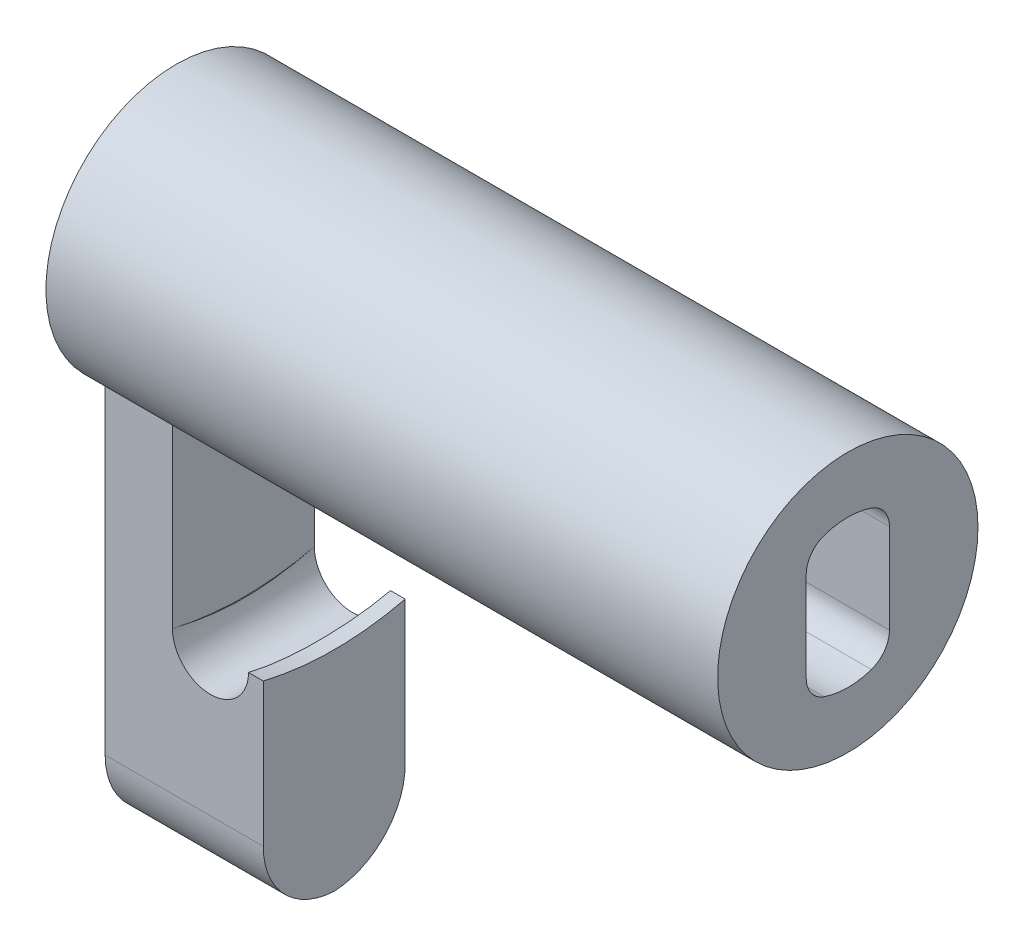
ISO-10303-21;
HEADER;
FILE_DESCRIPTION(('STEP AP214'),'2;1');
FILE_NAME('part.step','',(''),(''),'','','');
FILE_SCHEMA(('AUTOMOTIVE_DESIGN { 1 0 10303 214 1 1 1 1 }'));
ENDSEC;
DATA;
#1=APPLICATION_CONTEXT('core data for automotive mechanical design processes');
#2=APPLICATION_PROTOCOL_DEFINITION('international standard','automotive_design',2000,#1);
#3=PRODUCT_CONTEXT('',#1,'mechanical');
#4=PRODUCT('Part','Part','',(#3));
#5=PRODUCT_RELATED_PRODUCT_CATEGORY('part','',(#4));
#6=PRODUCT_DEFINITION_FORMATION('','',#4);
#7=PRODUCT_DEFINITION_CONTEXT('part definition',#1,'design');
#8=PRODUCT_DEFINITION('design','',#6,#7);
#9=PRODUCT_DEFINITION_SHAPE('','',#8);
#10=(LENGTH_UNIT() NAMED_UNIT(*) SI_UNIT(.MILLI.,.METRE.));
#11=(NAMED_UNIT(*) PLANE_ANGLE_UNIT() SI_UNIT($,.RADIAN.));
#12=(NAMED_UNIT(*) SI_UNIT($,.STERADIAN.) SOLID_ANGLE_UNIT());
#13=UNCERTAINTY_MEASURE_WITH_UNIT(LENGTH_MEASURE(1.E-05),#10,'distance_accuracy_value','');
#14=(GEOMETRIC_REPRESENTATION_CONTEXT(3) GLOBAL_UNCERTAINTY_ASSIGNED_CONTEXT((#13)) GLOBAL_UNIT_ASSIGNED_CONTEXT((#10,
#11,#12)) REPRESENTATION_CONTEXT('',''));
#15=CARTESIAN_POINT('',(0.,0.,0.));
#16=DIRECTION('',(0.,0.,1.));
#17=DIRECTION('',(1.,0.,0.));
#18=AXIS2_PLACEMENT_3D('',#15,#16,#17);
#19=CARTESIAN_POINT('',(-5.08441638698586,0.328655902743311,0.));
#20=DIRECTION('',(1.,0.,0.));
#21=DIRECTION('',(0.,0.,-1.));
#22=AXIS2_PLACEMENT_3D('',#19,#20,#21);
#23=CYLINDRICAL_SURFACE('',#22,20.32);
#24=CARTESIAN_POINT('',(4.516000112,-19.4253561897406,-4.7625));
#25=CARTESIAN_POINT('',(4.51602815605438,-19.4761397919226,-4.55186397752243));
#26=CARTESIAN_POINT('',(4.51751583624799,-19.5235494291915,-4.34042567248786));
#27=CARTESIAN_POINT('',(4.52241273918276,-19.6115780516741,-3.91617021463661));
#28=CARTESIAN_POINT('',(4.52582187954311,-19.6521973279214,-3.70335312132085));
#29=CARTESIAN_POINT('',(4.53356484956891,-19.7266136238928,-3.27650895221675));
#30=CARTESIAN_POINT('',(4.53789884704842,-19.7604094033339,-3.06248166371041));
#31=CARTESIAN_POINT('',(4.54668162054283,-19.8211392573607,-2.63345622071119));
#32=CARTESIAN_POINT('',(4.55113039739228,-19.8480732820403,-2.41845805916866));
#33=CARTESIAN_POINT('',(4.55940829823813,-19.8946999045536,-1.99093457231646));
#34=CARTESIAN_POINT('',(4.56324572568634,-19.9144951911243,-1.77842060795435));
#35=CARTESIAN_POINT('',(4.56989085821536,-19.9473821505317,-1.35285882034245));
#36=CARTESIAN_POINT('',(4.57269856674819,-19.9604738458416,-1.13981099888477));
#37=CARTESIAN_POINT('',(4.57695006547683,-19.9799372158945,-0.713428866385575));
#38=CARTESIAN_POINT('',(4.57839408420238,-19.9863100166236,-0.500094609348347));
#39=CARTESIAN_POINT('',(4.57976092663445,-19.9923324438611,-0.0733344566578538));
#40=CARTESIAN_POINT('',(4.57968377074263,-19.9919821605382,0.140091437728));
#41=CARTESIAN_POINT('',(4.57738082088596,-19.9818550621192,0.722132801893545));
#42=CARTESIAN_POINT('',(4.57363213215137,-19.9654032258704,1.09064622910877));
#43=CARTESIAN_POINT('',(4.56276431571364,-19.9124753478223,1.82619125768275));
#44=CARTESIAN_POINT('',(4.55564506983982,-19.8759986039487,2.19322280663227));
#45=CARTESIAN_POINT('',(4.54443834937838,-19.8060515095709,2.74424017250821));
#46=CARTESIAN_POINT('',(4.54058795591981,-19.7799763668355,2.92919724796145));
#47=CARTESIAN_POINT('',(4.53321609973828,-19.7227352488764,3.29833186147396));
#48=CARTESIAN_POINT('',(4.52969463377984,-19.6915693237359,3.48250940718395));
#49=CARTESIAN_POINT('',(4.52352813229226,-19.6241685777428,3.84994564719896));
#50=CARTESIAN_POINT('',(4.52088307740102,-19.5879338688973,4.03320436171511));
#51=CARTESIAN_POINT('',(4.51712674764682,-19.5104208287468,4.398674485403));
#52=CARTESIAN_POINT('',(4.51601553356354,-19.4691422976468,4.58088585278788));
#53=CARTESIAN_POINT('',(4.516000112,-19.4253561897406,4.76250000000001));
#54=B_SPLINE_CURVE_WITH_KNOTS('',3,(#24,#25,#26,#27,#28,#29,#30,#31,#32,#33,#34,#35,#36,#37,#38,
#39,#40,#41,#42,#43,#44,#45,#46,#47,#48,#49,#50,#51,#52,#53),.UNSPECIFIED.,.F.,.F.,(4,2,2,2,2,2,
2,2,2,2,2,2,2,2,4),(0.,0.649966912191417,1.29990595977909,1.94996303834195,2.60002484467298,
3.24032284066848,3.88061869011341,4.52080721850776,5.16098716083363,6.26708531920134,
7.37322225989914,7.93364039667409,8.49405302037505,9.05445326235574,9.61487571001093),.UNSPECIFIED.);
#55=CARTESIAN_POINT('',(4.516000112,-19.4253561897406,-4.7625));
#56=VERTEX_POINT('',#55);
#57=CARTESIAN_POINT('',(4.516000112,-19.4253561897406,4.7625));
#58=VERTEX_POINT('',#57);
#59=EDGE_CURVE('E221',#56,#58,#54,.T.);
#60=ORIENTED_EDGE('',*,*,#59,.F.);
#61=CARTESIAN_POINT('',(4.516000112,0.328655902743311,0.));
#62=DIRECTION('',(-1.,0.,0.));
#63=DIRECTION('',(0.,0.,1.));
#64=AXIS2_PLACEMENT_3D('',#61,#62,#63);
#65=CIRCLE('',#64,20.32);
#66=EDGE_CURVE('E247',#56,#58,#65,.T.);
#67=ORIENTED_EDGE('',*,*,#66,.T.);
#68=EDGE_LOOP('',(#60,#67));
#69=FACE_BOUND('',#68,.T.);
#70=ADVANCED_FACE('F49',(#69),#23,.F.);
#71=CARTESIAN_POINT('',(45.085,0.,0.));
#72=DIRECTION('',(-1.,0.,0.));
#73=DIRECTION('',(0.,0.,1.));
#74=AXIS2_PLACEMENT_3D('',#71,#72,#73);
#75=CYLINDRICAL_SURFACE('',#74,8.7376);
#76=CARTESIAN_POINT('',(45.085,0.,0.));
#77=DIRECTION('',(1.,0.,0.));
#78=DIRECTION('',(0.,0.,-1.));
#79=AXIS2_PLACEMENT_3D('',#76,#77,#78);
#80=CIRCLE('',#79,8.7376);
#81=CARTESIAN_POINT('',(45.085,0.,-8.7376));
#82=VERTEX_POINT('',#81);
#83=EDGE_CURVE('E291',#82,#82,#80,.T.);
#84=ORIENTED_EDGE('',*,*,#83,.F.);
#85=EDGE_LOOP('',(#84));
#86=FACE_BOUND('',#85,.T.);
#87=DIRECTION('',(-1.,0.,0.));
#88=VECTOR('',#87,1.);
#89=CARTESIAN_POINT('',(4.516000112,-7.32558854359157,-4.7625));
#90=LINE('',#89,#88);
#91=CARTESIAN_POINT('',(4.516000112,-7.32558854359157,-4.7625));
#92=VERTEX_POINT('',#91);
#93=CARTESIAN_POINT('',(0.,-7.32558854359157,-4.7625));
#94=VERTEX_POINT('',#93);
#95=EDGE_CURVE('E283',#92,#94,#90,.T.);
#96=ORIENTED_EDGE('',*,*,#95,.T.);
#97=CARTESIAN_POINT('',(0.,0.,0.));
#98=DIRECTION('',(1.,0.,0.));
#99=DIRECTION('',(0.,0.,-1.));
#100=AXIS2_PLACEMENT_3D('',#97,#98,#99);
#101=CIRCLE('',#100,8.7376);
#102=CARTESIAN_POINT('',(0.,-7.32558854359157,4.7625));
#103=VERTEX_POINT('',#102);
#104=EDGE_CURVE('E287',#94,#103,#101,.T.);
#105=ORIENTED_EDGE('',*,*,#104,.T.);
#106=DIRECTION('',(-1.,0.,0.));
#107=VECTOR('',#106,1.);
#108=CARTESIAN_POINT('',(4.516000112,-7.32558854359157,4.7625));
#109=LINE('',#108,#107);
#110=CARTESIAN_POINT('',(4.516000112,-7.32558854359157,4.7625));
#111=VERTEX_POINT('',#110);
#112=EDGE_CURVE('E276',#111,#103,#109,.T.);
#113=ORIENTED_EDGE('',*,*,#112,.F.);
#114=CARTESIAN_POINT('',(4.516000112,0.,0.));
#115=DIRECTION('',(-1.,0.,0.));
#116=DIRECTION('',(0.,0.,1.));
#117=AXIS2_PLACEMENT_3D('',#114,#115,#116);
#118=CIRCLE('',#117,8.7376);
#119=EDGE_CURVE('E272',#92,#111,#118,.T.);
#120=ORIENTED_EDGE('',*,*,#119,.F.);
#121=EDGE_LOOP('',(#96,#105,#113,#120));
#122=FACE_BOUND('',#121,.T.);
#123=ADVANCED_FACE('F411',(#86,#122),#75,.T.);
#124=CARTESIAN_POINT('',(45.085,0.,0.));
#125=DIRECTION('',(1.,0.,0.));
#126=DIRECTION('',(0.,0.,-1.));
#127=AXIS2_PLACEMENT_3D('',#124,#125,#126);
#128=PLANE('',#127);
#129=CARTESIAN_POINT('',(45.085,0.,0.));
#130=DIRECTION('',(1.,0.,0.));
#131=DIRECTION('',(0.,0.,-1.));
#132=AXIS2_PLACEMENT_3D('',#129,#130,#131);
#133=CIRCLE('',#132,4.953);
#134=CARTESIAN_POINT('',(45.085,4.69255908842926,-1.58496));
#135=VERTEX_POINT('',#134);
#136=CARTESIAN_POINT('',(45.085,4.69255908842926,1.58496));
#137=VERTEX_POINT('',#136);
#138=EDGE_CURVE('E520',#135,#137,#133,.T.);
#139=ORIENTED_EDGE('',*,*,#138,.F.);
#140=CARTESIAN_POINT('',(45.085,3.00805069771106,-1.016));
#141=DIRECTION('',(1.,0.,0.));
#142=DIRECTION('',(0.,0.,-1.));
#143=AXIS2_PLACEMENT_3D('',#140,#141,#142);
#144=CIRCLE('',#143,1.778);
#145=CARTESIAN_POINT('',(45.085,3.00805069771106,-2.794));
#146=VERTEX_POINT('',#145);
#147=EDGE_CURVE('E352',#135,#146,#144,.F.);
#148=ORIENTED_EDGE('',*,*,#147,.T.);
#149=DIRECTION('',(0.,1.,0.));
#150=VECTOR('',#149,1.);
#151=CARTESIAN_POINT('',(45.085,-4.08971551577857,-2.794));
#152=LINE('',#151,#150);
#153=CARTESIAN_POINT('',(45.085,-3.00805069771106,-2.794));
#154=VERTEX_POINT('',#153);
#155=EDGE_CURVE('E526',#154,#146,#152,.T.);
#156=ORIENTED_EDGE('',*,*,#155,.F.);
#157=CARTESIAN_POINT('',(45.085,-3.00805069771106,-1.016));
#158=DIRECTION('',(1.,0.,0.));
#159=DIRECTION('',(0.,0.,-1.));
#160=AXIS2_PLACEMENT_3D('',#157,#158,#159);
#161=CIRCLE('',#160,1.778);
#162=CARTESIAN_POINT('',(45.085,-4.69255908842926,-1.58496));
#163=VERTEX_POINT('',#162);
#164=EDGE_CURVE('E358',#154,#163,#161,.F.);
#165=ORIENTED_EDGE('',*,*,#164,.T.);
#166=CARTESIAN_POINT('',(45.085,0.,0.));
#167=DIRECTION('',(1.,0.,0.));
#168=DIRECTION('',(0.,0.,-1.));
#169=AXIS2_PLACEMENT_3D('',#166,#167,#168);
#170=CIRCLE('',#169,4.953);
#171=CARTESIAN_POINT('',(45.085,-4.69255908842926,1.58496));
#172=VERTEX_POINT('',#171);
#173=EDGE_CURVE('E545',#172,#163,#170,.T.);
#174=ORIENTED_EDGE('',*,*,#173,.F.);
#175=CARTESIAN_POINT('',(45.085,-3.00805069771106,1.016));
#176=DIRECTION('',(1.,0.,0.));
#177=DIRECTION('',(0.,0.,-1.));
#178=AXIS2_PLACEMENT_3D('',#175,#176,#177);
#179=CIRCLE('',#178,1.778);
#180=CARTESIAN_POINT('',(45.085,-3.00805069771106,2.794));
#181=VERTEX_POINT('',#180);
#182=EDGE_CURVE('E222',#172,#181,#179,.F.);
#183=ORIENTED_EDGE('',*,*,#182,.T.);
#184=DIRECTION('',(0.,-1.,0.));
#185=VECTOR('',#184,1.);
#186=CARTESIAN_POINT('',(45.085,-4.08971551577857,2.794));
#187=LINE('',#186,#185);
#188=CARTESIAN_POINT('',(45.085,3.00805069771106,2.794));
#189=VERTEX_POINT('',#188);
#190=EDGE_CURVE('E541',#189,#181,#187,.T.);
#191=ORIENTED_EDGE('',*,*,#190,.F.);
#192=CARTESIAN_POINT('',(45.085,3.00805069771106,1.016));
#193=DIRECTION('',(1.,0.,0.));
#194=DIRECTION('',(0.,0.,-1.));
#195=AXIS2_PLACEMENT_3D('',#192,#193,#194);
#196=CIRCLE('',#195,1.778);
#197=EDGE_CURVE('E355',#189,#137,#196,.F.);
#198=ORIENTED_EDGE('',*,*,#197,.T.);
#199=EDGE_LOOP('',(#139,#148,#156,#165,#174,#183,#191,#198));
#200=FACE_BOUND('',#199,.T.);
#201=ORIENTED_EDGE('',*,*,#83,.T.);
#202=EDGE_LOOP('',(#201));
#203=FACE_BOUND('',#202,.T.);
#204=ADVANCED_FACE('F418',(#200,#203),#128,.T.);
#205=CARTESIAN_POINT('',(0.,0.,0.));
#206=DIRECTION('',(1.,0.,0.));
#207=DIRECTION('',(0.,0.,-1.));
#208=AXIS2_PLACEMENT_3D('',#205,#206,#207);
#209=PLANE('',#208);
#210=CARTESIAN_POINT('',(0.,0.,0.));
#211=DIRECTION('',(-1.,0.,0.));
#212=DIRECTION('',(0.,0.,1.));
#213=AXIS2_PLACEMENT_3D('',#210,#211,#212);
#214=CIRCLE('',#213,4.064);
#215=CARTESIAN_POINT('',(0.,-3.29817815590477,2.37447191011236));
#216=VERTEX_POINT('',#215);
#217=CARTESIAN_POINT('',(0.,-3.29817815590477,-2.37447191011236));
#218=VERTEX_POINT('',#217);
#219=EDGE_CURVE('E510',#216,#218,#214,.T.);
#220=ORIENTED_EDGE('',*,*,#219,.F.);
#221=CARTESIAN_POINT('',(0.,-4.58652899805506,3.302));
#222=DIRECTION('',(1.,0.,0.));
#223=DIRECTION('',(0.,0.,-1.));
#224=AXIS2_PLACEMENT_3D('',#221,#222,#223);
#225=CIRCLE('',#224,1.5875);
#226=CARTESIAN_POINT('',(0.,-4.58652899805506,1.7145));
#227=VERTEX_POINT('',#226);
#228=EDGE_CURVE('E437',#216,#227,#225,.F.);
#229=ORIENTED_EDGE('',*,*,#228,.T.);
#230=DIRECTION('',(0.,1.,0.));
#231=VECTOR('',#230,1.);
#232=CARTESIAN_POINT('',(0.,-3.68464187540662,1.7145));
#233=LINE('',#232,#231);
#234=CARTESIAN_POINT('',(0.,-5.58964187540662,1.7145));
#235=VERTEX_POINT('',#234);
#236=EDGE_CURVE('E481',#235,#227,#233,.T.);
#237=ORIENTED_EDGE('',*,*,#236,.F.);
#238=CARTESIAN_POINT('',(0.,-5.58964187540662,0.127));
#239=DIRECTION('',(1.,0.,0.));
#240=DIRECTION('',(0.,0.,-1.));
#241=AXIS2_PLACEMENT_3D('',#238,#239,#240);
#242=CIRCLE('',#241,1.5875);
#243=CARTESIAN_POINT('',(0.,-7.17714187540662,0.127));
#244=VERTEX_POINT('',#243);
#245=EDGE_CURVE('E469',#235,#244,#242,.T.);
#246=ORIENTED_EDGE('',*,*,#245,.T.);
#247=DIRECTION('',(0.,0.,1.));
#248=VECTOR('',#247,1.);
#249=CARTESIAN_POINT('',(0.,-7.17714187540662,1.7145));
#250=LINE('',#249,#248);
#251=CARTESIAN_POINT('',(0.,-7.17714187540662,-0.127000000000001));
#252=VERTEX_POINT('',#251);
#253=EDGE_CURVE('E479',#252,#244,#250,.T.);
#254=ORIENTED_EDGE('',*,*,#253,.F.);
#255=CARTESIAN_POINT('',(0.,-5.58964187540662,-0.127));
#256=DIRECTION('',(1.,0.,0.));
#257=DIRECTION('',(0.,0.,-1.));
#258=AXIS2_PLACEMENT_3D('',#255,#256,#257);
#259=CIRCLE('',#258,1.5875);
#260=CARTESIAN_POINT('',(0.,-5.58964187540662,-1.7145));
#261=VERTEX_POINT('',#260);
#262=EDGE_CURVE('E11',#252,#261,#259,.T.);
#263=ORIENTED_EDGE('',*,*,#262,.T.);
#264=DIRECTION('',(0.,-1.,0.));
#265=VECTOR('',#264,1.);
#266=CARTESIAN_POINT('',(0.,-3.68464187540662,-1.7145));
#267=LINE('',#266,#265);
#268=CARTESIAN_POINT('',(0.,-4.58652899805506,-1.7145));
#269=VERTEX_POINT('',#268);
#270=EDGE_CURVE('E491',#269,#261,#267,.T.);
#271=ORIENTED_EDGE('',*,*,#270,.F.);
#272=CARTESIAN_POINT('',(0.,-4.58652899805506,-3.302));
#273=DIRECTION('',(1.,0.,0.));
#274=DIRECTION('',(0.,0.,-1.));
#275=AXIS2_PLACEMENT_3D('',#272,#273,#274);
#276=CIRCLE('',#275,1.5875);
#277=EDGE_CURVE('E432',#269,#218,#276,.F.);
#278=ORIENTED_EDGE('',*,*,#277,.T.);
#279=EDGE_LOOP('',(#220,#229,#237,#246,#254,#263,#271,#278));
#280=FACE_BOUND('',#279,.T.);
#281=CARTESIAN_POINT('',(0.,-29.036,0.2375));
#282=DIRECTION('',(1.,0.,0.));
#283=DIRECTION('',(0.,0.,-1.));
#284=AXIS2_PLACEMENT_3D('',#281,#282,#283);
#285=CIRCLE('',#284,5.);
#286=CARTESIAN_POINT('',(0.,-29.036,-4.7625));
#287=VERTEX_POINT('',#286);
#288=CARTESIAN_POINT('',(0.,-34.0303561897406,0.));
#289=VERTEX_POINT('',#288);
#290=EDGE_CURVE('E295',#287,#289,#285,.F.);
#291=ORIENTED_EDGE('',*,*,#290,.T.);
#292=CARTESIAN_POINT('',(0.,-29.036,-0.2375));
#293=DIRECTION('',(1.,0.,0.));
#294=DIRECTION('',(0.,0.,-1.));
#295=AXIS2_PLACEMENT_3D('',#292,#293,#294);
#296=CIRCLE('',#295,5.);
#297=CARTESIAN_POINT('',(0.,-29.036,4.7625));
#298=VERTEX_POINT('',#297);
#299=EDGE_CURVE('E300',#289,#298,#296,.F.);
#300=ORIENTED_EDGE('',*,*,#299,.T.);
#301=DIRECTION('',(0.,-1.,0.));
#302=VECTOR('',#301,1.);
#303=CARTESIAN_POINT('',(0.,0.,4.7625));
#304=LINE('',#303,#302);
#305=EDGE_CURVE('E268',#103,#298,#304,.T.);
#306=ORIENTED_EDGE('',*,*,#305,.F.);
#307=ORIENTED_EDGE('',*,*,#104,.F.);
#308=DIRECTION('',(0.,1.,0.));
#309=VECTOR('',#308,1.);
#310=CARTESIAN_POINT('',(0.,0.,-4.7625));
#311=LINE('',#310,#309);
#312=EDGE_CURVE('E277',#287,#94,#311,.T.);
#313=ORIENTED_EDGE('',*,*,#312,.F.);
#314=EDGE_LOOP('',(#291,#300,#306,#307,#313));
#315=FACE_BOUND('',#314,.T.);
#316=ADVANCED_FACE('F477',(#280,#315),#209,.F.);
#317=CARTESIAN_POINT('',(4.516000112,0.,-4.7625));
#318=DIRECTION('',(0.,0.,1.));
#319=DIRECTION('',(1.,0.,0.));
#320=AXIS2_PLACEMENT_3D('',#317,#318,#319);
#321=PLANE('',#320);
#322=DIRECTION('',(0.,1.,0.));
#323=VECTOR('',#322,1.);
#324=CARTESIAN_POINT('',(4.516000112,0.,-4.7625));
#325=LINE('',#324,#323);
#326=EDGE_CURVE('E231',#56,#92,#325,.T.);
#327=ORIENTED_EDGE('',*,*,#326,.F.);
#328=CARTESIAN_POINT('',(7.068700112,-19.4253561897406,-4.7625));
#329=DIRECTION('',(0.,0.,-1.));
#330=DIRECTION('',(0.,1.,0.));
#331=AXIS2_PLACEMENT_3D('',#328,#329,#330);
#332=CIRCLE('',#331,2.5527);
#333=CARTESIAN_POINT('',(9.621400112,-19.4253561897406,-4.7625));
#334=VERTEX_POINT('',#333);
#335=EDGE_CURVE('E213',#334,#56,#332,.T.);
#336=ORIENTED_EDGE('',*,*,#335,.F.);
#337=DIRECTION('',(1.,0.,0.));
#338=VECTOR('',#337,1.);
#339=CARTESIAN_POINT('',(-5.08441638698586,-19.4253561897406,-4.7625));
#340=LINE('',#339,#338);
#341=CARTESIAN_POINT('',(10.612000112,-19.4253561897406,-4.7625));
#342=VERTEX_POINT('',#341);
#343=EDGE_CURVE('E228',#334,#342,#340,.T.);
#344=ORIENTED_EDGE('',*,*,#343,.T.);
#345=DIRECTION('',(0.,1.,0.));
#346=VECTOR('',#345,1.);
#347=CARTESIAN_POINT('',(10.612000112,0.,-4.7625));
#348=LINE('',#347,#346);
#349=CARTESIAN_POINT('',(10.612000112,-29.036,-4.7625));
#350=VERTEX_POINT('',#349);
#351=EDGE_CURVE('E261',#350,#342,#348,.T.);
#352=ORIENTED_EDGE('',*,*,#351,.F.);
#353=DIRECTION('',(-1.,0.,0.));
#354=VECTOR('',#353,1.);
#355=CARTESIAN_POINT('',(4.516000112,-29.036,-4.7625));
#356=LINE('',#355,#354);
#357=EDGE_CURVE('E307',#350,#287,#356,.T.);
#358=ORIENTED_EDGE('',*,*,#357,.T.);
#359=ORIENTED_EDGE('',*,*,#312,.T.);
#360=ORIENTED_EDGE('',*,*,#95,.F.);
#361=EDGE_LOOP('',(#327,#336,#344,#352,#358,#359,#360));
#362=FACE_BOUND('',#361,.T.);
#363=ADVANCED_FACE('F226',(#362),#321,.F.);
#364=CARTESIAN_POINT('',(4.516000112,0.,4.7625));
#365=DIRECTION('',(0.,0.,-1.));
#366=DIRECTION('',(-1.,0.,0.));
#367=AXIS2_PLACEMENT_3D('',#364,#365,#366);
#368=PLANE('',#367);
#369=DIRECTION('',(1.,0.,0.));
#370=VECTOR('',#369,1.);
#371=CARTESIAN_POINT('',(-5.08441638698586,-19.4253561897406,4.7625));
#372=LINE('',#371,#370);
#373=CARTESIAN_POINT('',(9.62140011200001,-19.4253561897406,4.7625));
#374=VERTEX_POINT('',#373);
#375=CARTESIAN_POINT('',(10.612000112,-19.4253561897406,4.7625));
#376=VERTEX_POINT('',#375);
#377=EDGE_CURVE('E241',#374,#376,#372,.T.);
#378=ORIENTED_EDGE('',*,*,#377,.F.);
#379=CARTESIAN_POINT('',(7.068700112,-19.4253561897406,4.7625));
#380=DIRECTION('',(0.,0.,-1.));
#381=DIRECTION('',(-1.,0.,0.));
#382=AXIS2_PLACEMENT_3D('',#379,#380,#381);
#383=CIRCLE('',#382,2.5527);
#384=EDGE_CURVE('E216',#374,#58,#383,.T.);
#385=ORIENTED_EDGE('',*,*,#384,.T.);
#386=DIRECTION('',(0.,-1.,0.));
#387=VECTOR('',#386,1.);
#388=CARTESIAN_POINT('',(4.516000112,0.,4.7625));
#389=LINE('',#388,#387);
#390=EDGE_CURVE('E267',#111,#58,#389,.T.);
#391=ORIENTED_EDGE('',*,*,#390,.F.);
#392=ORIENTED_EDGE('',*,*,#112,.T.);
#393=ORIENTED_EDGE('',*,*,#305,.T.);
#394=DIRECTION('',(-1.,0.,0.));
#395=VECTOR('',#394,1.);
#396=CARTESIAN_POINT('',(4.516000112,-29.036,4.7625));
#397=LINE('',#396,#395);
#398=CARTESIAN_POINT('',(10.612000112,-29.036,4.7625));
#399=VERTEX_POINT('',#398);
#400=EDGE_CURVE('E303',#298,#399,#397,.F.);
#401=ORIENTED_EDGE('',*,*,#400,.T.);
#402=DIRECTION('',(0.,-1.,0.));
#403=VECTOR('',#402,1.);
#404=CARTESIAN_POINT('',(10.612000112,0.,4.7625));
#405=LINE('',#404,#403);
#406=EDGE_CURVE('E245',#376,#399,#405,.T.);
#407=ORIENTED_EDGE('',*,*,#406,.F.);
#408=EDGE_LOOP('',(#378,#385,#391,#392,#393,#401,#407));
#409=FACE_BOUND('',#408,.T.);
#410=ADVANCED_FACE('F590',(#409),#368,.F.);
#411=CARTESIAN_POINT('',(4.516000112,0.,0.));
#412=DIRECTION('',(-1.,0.,0.));
#413=DIRECTION('',(0.,0.,1.));
#414=AXIS2_PLACEMENT_3D('',#411,#412,#413);
#415=PLANE('',#414);
#416=ORIENTED_EDGE('',*,*,#390,.T.);
#417=ORIENTED_EDGE('',*,*,#66,.F.);
#418=ORIENTED_EDGE('',*,*,#326,.T.);
#419=ORIENTED_EDGE('',*,*,#119,.T.);
#420=EDGE_LOOP('',(#416,#417,#418,#419));
#421=FACE_BOUND('',#420,.T.);
#422=ADVANCED_FACE('F602',(#421),#415,.F.);
#423=CARTESIAN_POINT('',(4.516000112,-29.036,0.2375));
#424=DIRECTION('',(-1.,0.,0.));
#425=DIRECTION('',(0.,0.,1.));
#426=AXIS2_PLACEMENT_3D('',#423,#424,#425);
#427=CYLINDRICAL_SURFACE('',#426,5.);
#428=ORIENTED_EDGE('',*,*,#357,.F.);
#429=CARTESIAN_POINT('',(10.612000112,-29.036,0.2375));
#430=DIRECTION('',(1.,0.,0.));
#431=DIRECTION('',(0.,0.,-1.));
#432=AXIS2_PLACEMENT_3D('',#429,#430,#431);
#433=CIRCLE('',#432,5.);
#434=CARTESIAN_POINT('',(10.612000112,-34.0303561897406,0.));
#435=VERTEX_POINT('',#434);
#436=EDGE_CURVE('E257',#435,#350,#433,.T.);
#437=ORIENTED_EDGE('',*,*,#436,.F.);
#438=DIRECTION('',(-1.,0.,0.));
#439=VECTOR('',#438,1.);
#440=CARTESIAN_POINT('',(2.258000056,-34.0303561897406,0.));
#441=LINE('',#440,#439);
#442=EDGE_CURVE('E264',#289,#435,#441,.F.);
#443=ORIENTED_EDGE('',*,*,#442,.F.);
#444=ORIENTED_EDGE('',*,*,#290,.F.);
#445=EDGE_LOOP('',(#428,#437,#443,#444));
#446=FACE_BOUND('',#445,.T.);
#447=ADVANCED_FACE('F600',(#446),#427,.T.);
#448=CARTESIAN_POINT('',(4.516000112,-29.036,-0.2375));
#449=DIRECTION('',(-1.,0.,0.));
#450=DIRECTION('',(0.,0.,1.));
#451=AXIS2_PLACEMENT_3D('',#448,#449,#450);
#452=CYLINDRICAL_SURFACE('',#451,5.);
#453=ORIENTED_EDGE('',*,*,#442,.T.);
#454=CARTESIAN_POINT('',(10.612000112,-29.036,-0.2375));
#455=DIRECTION('',(1.,0.,0.));
#456=DIRECTION('',(0.,0.,-1.));
#457=AXIS2_PLACEMENT_3D('',#454,#455,#456);
#458=CIRCLE('',#457,5.);
#459=EDGE_CURVE('E253',#399,#435,#458,.T.);
#460=ORIENTED_EDGE('',*,*,#459,.F.);
#461=ORIENTED_EDGE('',*,*,#400,.F.);
#462=ORIENTED_EDGE('',*,*,#299,.F.);
#463=EDGE_LOOP('',(#453,#460,#461,#462));
#464=FACE_BOUND('',#463,.T.);
#465=ADVANCED_FACE('F595',(#464),#452,.T.);
#466=CARTESIAN_POINT('',(10.612000112,0.,0.));
#467=DIRECTION('',(1.,0.,0.));
#468=DIRECTION('',(0.,0.,-1.));
#469=AXIS2_PLACEMENT_3D('',#466,#467,#468);
#470=PLANE('',#469);
#471=ORIENTED_EDGE('',*,*,#351,.T.);
#472=CARTESIAN_POINT('',(10.612000112,0.328655902743311,0.));
#473=DIRECTION('',(1.,0.,0.));
#474=DIRECTION('',(0.,0.,-1.));
#475=AXIS2_PLACEMENT_3D('',#472,#473,#474);
#476=CIRCLE('',#475,20.32);
#477=EDGE_CURVE('E238',#342,#376,#476,.F.);
#478=ORIENTED_EDGE('',*,*,#477,.T.);
#479=ORIENTED_EDGE('',*,*,#406,.T.);
#480=ORIENTED_EDGE('',*,*,#459,.T.);
#481=ORIENTED_EDGE('',*,*,#436,.T.);
#482=EDGE_LOOP('',(#471,#478,#479,#480,#481));
#483=FACE_BOUND('',#482,.T.);
#484=ADVANCED_FACE('F408',(#483),#470,.T.);
#485=CARTESIAN_POINT('',(9.62140011200001,-19.4253561897406,4.76250000000001));
#486=CARTESIAN_POINT('',(9.62137206794563,-19.4761397919226,4.55186397752244));
#487=CARTESIAN_POINT('',(9.61988438775201,-19.5235494291915,4.34042567248786));
#488=CARTESIAN_POINT('',(9.61498748481723,-19.6115780516741,3.91617021463662));
#489=CARTESIAN_POINT('',(9.61157834445689,-19.6521973279214,3.70335312132086));
#490=CARTESIAN_POINT('',(9.60383537443108,-19.7266136238928,3.27650895221675));
#491=CARTESIAN_POINT('',(9.59950137695158,-19.7604094033339,3.06248166371042));
#492=CARTESIAN_POINT('',(9.59071860345717,-19.8211392573607,2.6334562207112));
#493=CARTESIAN_POINT('',(9.58626982660772,-19.8480732820403,2.41845805916867));
#494=CARTESIAN_POINT('',(9.57799192576186,-19.8946999045536,1.99093457231647));
#495=CARTESIAN_POINT('',(9.57415449831365,-19.9144951911243,1.77842060795436));
#496=CARTESIAN_POINT('',(9.56750936578464,-19.9473821505317,1.35285882034246));
#497=CARTESIAN_POINT('',(9.56470165725181,-19.9604738458416,1.13981099888478));
#498=CARTESIAN_POINT('',(9.56045015852317,-19.9799372158945,0.713428866385582));
#499=CARTESIAN_POINT('',(9.55900613979761,-19.9863100166236,0.500094609348354));
#500=CARTESIAN_POINT('',(9.55763929736555,-19.9923324438611,0.0733344566578609));
#501=CARTESIAN_POINT('',(9.55771645325737,-19.9919821605382,-0.140091437727993));
#502=CARTESIAN_POINT('',(9.56001940311404,-19.9818550621192,-0.722132801893537));
#503=CARTESIAN_POINT('',(9.56376809184863,-19.9654032258704,-1.09064622910876));
#504=CARTESIAN_POINT('',(9.57463590828636,-19.9124753478223,-1.82619125768275));
#505=CARTESIAN_POINT('',(9.58175515416018,-19.8759986039487,-2.19322280663227));
#506=CARTESIAN_POINT('',(9.59296187462162,-19.8060515095709,-2.7442401725082));
#507=CARTESIAN_POINT('',(9.59681226808018,-19.7799763668355,-2.92919724796144));
#508=CARTESIAN_POINT('',(9.60418412426172,-19.7227352488764,-3.29833186147394));
#509=CARTESIAN_POINT('',(9.60770559022015,-19.6915693237359,-3.48250940718394));
#510=CARTESIAN_POINT('',(9.61387209170774,-19.6241685777428,-3.84994564719895));
#511=CARTESIAN_POINT('',(9.61651714659898,-19.5879338688973,-4.03320436171509));
#512=CARTESIAN_POINT('',(9.62027347635317,-19.5104208287468,-4.39867448540299));
#513=CARTESIAN_POINT('',(9.62138469043646,-19.4691422976468,-4.58088585278787));
#514=CARTESIAN_POINT('',(9.621400112,-19.4253561897406,-4.7625));
#515=B_SPLINE_CURVE_WITH_KNOTS('',3,(#485,#486,#487,#488,#489,#490,#491,#492,#493,#494,#495,
#496,#497,#498,#499,#500,#501,#502,#503,#504,#505,#506,#507,#508,#509,#510,#511,#512,#513,#514),
.UNSPECIFIED.,.F.,.F.,(4,2,2,2,2,2,2,2,2,2,2,2,2,2,4),(0.,0.649966912191416,1.29990595977909,
1.94996303834195,2.60002484467298,3.24032284066848,3.88061869011341,4.52080721850776,
5.16098716083363,6.26708531920134,7.37322225989914,7.93364039667409,8.49405302037505,
9.05445326235574,9.61487571001093),.UNSPECIFIED.);
#516=EDGE_CURVE('E210',#374,#334,#515,.T.);
#517=ORIENTED_EDGE('',*,*,#516,.F.);
#518=ORIENTED_EDGE('',*,*,#377,.T.);
#519=ORIENTED_EDGE('',*,*,#477,.F.);
#520=ORIENTED_EDGE('',*,*,#343,.F.);
#521=EDGE_LOOP('',(#517,#518,#519,#520));
#522=FACE_BOUND('',#521,.T.);
#523=ADVANCED_FACE('F236',(#522),#23,.F.);
#524=CARTESIAN_POINT('',(32.893,0.,0.));
#525=DIRECTION('',(1.,0.,0.));
#526=DIRECTION('',(0.,0.,-1.));
#527=AXIS2_PLACEMENT_3D('',#524,#525,#526);
#528=CYLINDRICAL_SURFACE('',#527,4.953);
#529=CARTESIAN_POINT('',(32.893,0.,0.));
#530=DIRECTION('',(1.,0.,0.));
#531=DIRECTION('',(0.,0.,-1.));
#532=AXIS2_PLACEMENT_3D('',#529,#530,#531);
#533=CIRCLE('',#532,4.953);
#534=CARTESIAN_POINT('',(32.893,4.69255908842926,-1.58496));
#535=VERTEX_POINT('',#534);
#536=CARTESIAN_POINT('',(32.893,4.69255908842926,1.58496));
#537=VERTEX_POINT('',#536);
#538=EDGE_CURVE('E521',#535,#537,#533,.T.);
#539=ORIENTED_EDGE('',*,*,#538,.F.);
#540=DIRECTION('',(1.,0.,0.));
#541=VECTOR('',#540,1.);
#542=CARTESIAN_POINT('',(32.893,4.69255908842926,-1.58496));
#543=LINE('',#542,#541);
#544=EDGE_CURVE('E315',#535,#135,#543,.T.);
#545=ORIENTED_EDGE('',*,*,#544,.T.);
#546=ORIENTED_EDGE('',*,*,#138,.T.);
#547=DIRECTION('',(1.,0.,0.));
#548=VECTOR('',#547,1.);
#549=CARTESIAN_POINT('',(32.893,4.69255908842926,1.58496));
#550=LINE('',#549,#548);
#551=EDGE_CURVE('E310',#137,#537,#550,.F.);
#552=ORIENTED_EDGE('',*,*,#551,.T.);
#553=EDGE_LOOP('',(#539,#545,#546,#552));
#554=FACE_BOUND('',#553,.T.);
#555=ADVANCED_FACE('F395',(#554),#528,.F.);
#556=CARTESIAN_POINT('',(32.893,-4.08971551577857,-2.794));
#557=DIRECTION('',(0.,0.,-1.));
#558=DIRECTION('',(-1.,0.,0.));
#559=AXIS2_PLACEMENT_3D('',#556,#557,#558);
#560=PLANE('',#559);
#561=ORIENTED_EDGE('',*,*,#155,.T.);
#562=DIRECTION('',(-1.,0.,0.));
#563=VECTOR('',#562,1.);
#564=CARTESIAN_POINT('',(32.893,3.00805069771106,-2.794));
#565=LINE('',#564,#563);
#566=CARTESIAN_POINT('',(32.893,3.00805069771106,-2.794));
#567=VERTEX_POINT('',#566);
#568=EDGE_CURVE('E323',#146,#567,#565,.T.);
#569=ORIENTED_EDGE('',*,*,#568,.T.);
#570=DIRECTION('',(0.,1.,0.));
#571=VECTOR('',#570,1.);
#572=CARTESIAN_POINT('',(32.893,-4.08971551577857,-2.794));
#573=LINE('',#572,#571);
#574=CARTESIAN_POINT('',(32.893,-3.00805069771106,-2.794));
#575=VERTEX_POINT('',#574);
#576=EDGE_CURVE('E534',#575,#567,#573,.T.);
#577=ORIENTED_EDGE('',*,*,#576,.F.);
#578=DIRECTION('',(-1.,0.,0.));
#579=VECTOR('',#578,1.);
#580=CARTESIAN_POINT('',(45.085,-3.00805069771106,-2.794));
#581=LINE('',#580,#579);
#582=EDGE_CURVE('E319',#575,#154,#581,.F.);
#583=ORIENTED_EDGE('',*,*,#582,.T.);
#584=EDGE_LOOP('',(#561,#569,#577,#583));
#585=FACE_BOUND('',#584,.T.);
#586=ADVANCED_FACE('F391',(#585),#560,.F.);
#587=CARTESIAN_POINT('',(32.893,0.,0.));
#588=DIRECTION('',(1.,0.,0.));
#589=DIRECTION('',(0.,0.,-1.));
#590=AXIS2_PLACEMENT_3D('',#587,#588,#589);
#591=CYLINDRICAL_SURFACE('',#590,4.953);
#592=ORIENTED_EDGE('',*,*,#173,.T.);
#593=DIRECTION('',(1.,0.,0.));
#594=VECTOR('',#593,1.);
#595=CARTESIAN_POINT('',(32.893,-4.69255908842926,-1.58496));
#596=LINE('',#595,#594);
#597=CARTESIAN_POINT('',(32.893,-4.69255908842926,-1.58496));
#598=VERTEX_POINT('',#597);
#599=EDGE_CURVE('E349',#163,#598,#596,.F.);
#600=ORIENTED_EDGE('',*,*,#599,.T.);
#601=CARTESIAN_POINT('',(32.893,0.,0.));
#602=DIRECTION('',(1.,0.,0.));
#603=DIRECTION('',(0.,0.,-1.));
#604=AXIS2_PLACEMENT_3D('',#601,#602,#603);
#605=CIRCLE('',#604,4.953);
#606=CARTESIAN_POINT('',(32.893,-4.69255908842926,1.58496));
#607=VERTEX_POINT('',#606);
#608=EDGE_CURVE('E530',#607,#598,#605,.T.);
#609=ORIENTED_EDGE('',*,*,#608,.F.);
#610=DIRECTION('',(1.,0.,0.));
#611=VECTOR('',#610,1.);
#612=CARTESIAN_POINT('',(32.893,-4.69255908842926,1.58496));
#613=LINE('',#612,#611);
#614=EDGE_CURVE('E345',#607,#172,#613,.T.);
#615=ORIENTED_EDGE('',*,*,#614,.T.);
#616=EDGE_LOOP('',(#592,#600,#609,#615));
#617=FACE_BOUND('',#616,.T.);
#618=ADVANCED_FACE('F394',(#617),#591,.F.);
#619=CARTESIAN_POINT('',(32.893,-4.08971551577857,2.794));
#620=DIRECTION('',(0.,0.,1.));
#621=DIRECTION('',(1.,0.,0.));
#622=AXIS2_PLACEMENT_3D('',#619,#620,#621);
#623=PLANE('',#622);
#624=DIRECTION('',(0.,-1.,0.));
#625=VECTOR('',#624,1.);
#626=CARTESIAN_POINT('',(32.893,-4.08971551577857,2.794));
#627=LINE('',#626,#625);
#628=CARTESIAN_POINT('',(32.893,3.00805069771106,2.794));
#629=VERTEX_POINT('',#628);
#630=CARTESIAN_POINT('',(32.893,-3.00805069771106,2.794));
#631=VERTEX_POINT('',#630);
#632=EDGE_CURVE('E525',#629,#631,#627,.T.);
#633=ORIENTED_EDGE('',*,*,#632,.F.);
#634=DIRECTION('',(-1.,0.,0.));
#635=VECTOR('',#634,1.);
#636=CARTESIAN_POINT('',(45.085,3.00805069771106,2.794));
#637=LINE('',#636,#635);
#638=EDGE_CURVE('E341',#629,#189,#637,.F.);
#639=ORIENTED_EDGE('',*,*,#638,.T.);
#640=ORIENTED_EDGE('',*,*,#190,.T.);
#641=DIRECTION('',(-1.,0.,0.));
#642=VECTOR('',#641,1.);
#643=CARTESIAN_POINT('',(32.893,-3.00805069771106,2.794));
#644=LINE('',#643,#642);
#645=EDGE_CURVE('E338',#181,#631,#644,.T.);
#646=ORIENTED_EDGE('',*,*,#645,.T.);
#647=EDGE_LOOP('',(#633,#639,#640,#646));
#648=FACE_BOUND('',#647,.T.);
#649=ADVANCED_FACE('F389',(#648),#623,.F.);
#650=CARTESIAN_POINT('',(32.893,0.,0.));
#651=DIRECTION('',(1.,0.,0.));
#652=DIRECTION('',(0.,0.,-1.));
#653=AXIS2_PLACEMENT_3D('',#650,#651,#652);
#654=PLANE('',#653);
#655=ORIENTED_EDGE('',*,*,#576,.T.);
#656=CARTESIAN_POINT('',(32.893,3.00805069771106,-1.016));
#657=DIRECTION('',(1.,0.,0.));
#658=DIRECTION('',(0.,0.,-1.));
#659=AXIS2_PLACEMENT_3D('',#656,#657,#658);
#660=CIRCLE('',#659,1.778);
#661=EDGE_CURVE('E335',#567,#535,#660,.T.);
#662=ORIENTED_EDGE('',*,*,#661,.T.);
#663=ORIENTED_EDGE('',*,*,#538,.T.);
#664=CARTESIAN_POINT('',(32.893,3.00805069771106,1.016));
#665=DIRECTION('',(1.,0.,0.));
#666=DIRECTION('',(0.,0.,-1.));
#667=AXIS2_PLACEMENT_3D('',#664,#665,#666);
#668=CIRCLE('',#667,1.778);
#669=EDGE_CURVE('E332',#537,#629,#668,.T.);
#670=ORIENTED_EDGE('',*,*,#669,.T.);
#671=ORIENTED_EDGE('',*,*,#632,.T.);
#672=CARTESIAN_POINT('',(32.893,-3.00805069771106,1.016));
#673=DIRECTION('',(1.,0.,0.));
#674=DIRECTION('',(0.,0.,-1.));
#675=AXIS2_PLACEMENT_3D('',#672,#673,#674);
#676=CIRCLE('',#675,1.778);
#677=EDGE_CURVE('E326',#631,#607,#676,.T.);
#678=ORIENTED_EDGE('',*,*,#677,.T.);
#679=ORIENTED_EDGE('',*,*,#608,.T.);
#680=CARTESIAN_POINT('',(32.893,-3.00805069771106,-1.016));
#681=DIRECTION('',(1.,0.,0.));
#682=DIRECTION('',(0.,0.,-1.));
#683=AXIS2_PLACEMENT_3D('',#680,#681,#682);
#684=CIRCLE('',#683,1.778);
#685=EDGE_CURVE('E329',#598,#575,#684,.T.);
#686=ORIENTED_EDGE('',*,*,#685,.T.);
#687=EDGE_LOOP('',(#655,#662,#663,#670,#671,#678,#679,#686));
#688=FACE_BOUND('',#687,.T.);
#689=ADVANCED_FACE('F384',(#688),#654,.T.);
#690=CARTESIAN_POINT('',(32.893,3.00805069771106,-1.016));
#691=DIRECTION('',(1.,0.,0.));
#692=DIRECTION('',(0.,0.,-1.));
#693=AXIS2_PLACEMENT_3D('',#690,#691,#692);
#694=CYLINDRICAL_SURFACE('',#693,1.778);
#695=ORIENTED_EDGE('',*,*,#661,.F.);
#696=ORIENTED_EDGE('',*,*,#568,.F.);
#697=ORIENTED_EDGE('',*,*,#147,.F.);
#698=ORIENTED_EDGE('',*,*,#544,.F.);
#699=EDGE_LOOP('',(#695,#696,#697,#698));
#700=FACE_BOUND('',#699,.T.);
#701=ADVANCED_FACE('F388',(#700),#694,.F.);
#702=CARTESIAN_POINT('',(32.893,3.00805069771106,1.016));
#703=DIRECTION('',(1.,0.,0.));
#704=DIRECTION('',(0.,0.,-1.));
#705=AXIS2_PLACEMENT_3D('',#702,#703,#704);
#706=CYLINDRICAL_SURFACE('',#705,1.778);
#707=ORIENTED_EDGE('',*,*,#669,.F.);
#708=ORIENTED_EDGE('',*,*,#551,.F.);
#709=ORIENTED_EDGE('',*,*,#197,.F.);
#710=ORIENTED_EDGE('',*,*,#638,.F.);
#711=EDGE_LOOP('',(#707,#708,#709,#710));
#712=FACE_BOUND('',#711,.T.);
#713=ADVANCED_FACE('F564',(#712),#706,.F.);
#714=CARTESIAN_POINT('',(32.893,-3.00805069771106,-1.016));
#715=DIRECTION('',(1.,0.,0.));
#716=DIRECTION('',(0.,0.,-1.));
#717=AXIS2_PLACEMENT_3D('',#714,#715,#716);
#718=CYLINDRICAL_SURFACE('',#717,1.778);
#719=ORIENTED_EDGE('',*,*,#685,.F.);
#720=ORIENTED_EDGE('',*,*,#599,.F.);
#721=ORIENTED_EDGE('',*,*,#164,.F.);
#722=ORIENTED_EDGE('',*,*,#582,.F.);
#723=EDGE_LOOP('',(#719,#720,#721,#722));
#724=FACE_BOUND('',#723,.T.);
#725=ADVANCED_FACE('F577',(#724),#718,.F.);
#726=CARTESIAN_POINT('',(32.893,-3.00805069771106,1.016));
#727=DIRECTION('',(1.,0.,0.));
#728=DIRECTION('',(0.,0.,-1.));
#729=AXIS2_PLACEMENT_3D('',#726,#727,#728);
#730=CYLINDRICAL_SURFACE('',#729,1.778);
#731=ORIENTED_EDGE('',*,*,#677,.F.);
#732=ORIENTED_EDGE('',*,*,#645,.F.);
#733=ORIENTED_EDGE('',*,*,#182,.F.);
#734=ORIENTED_EDGE('',*,*,#614,.F.);
#735=EDGE_LOOP('',(#731,#732,#733,#734));
#736=FACE_BOUND('',#735,.T.);
#737=ADVANCED_FACE('F382',(#736),#730,.F.);
#738=CARTESIAN_POINT('',(7.068700112,-19.4253561897406,8.7376));
#739=DIRECTION('',(0.,0.,-1.));
#740=DIRECTION('',(0.,1.,0.));
#741=AXIS2_PLACEMENT_3D('',#738,#739,#740);
#742=CYLINDRICAL_SURFACE('',#741,2.5527);
#743=ORIENTED_EDGE('',*,*,#59,.T.);
#744=ORIENTED_EDGE('',*,*,#384,.F.);
#745=ORIENTED_EDGE('',*,*,#516,.T.);
#746=ORIENTED_EDGE('',*,*,#335,.T.);
#747=EDGE_LOOP('',(#743,#744,#745,#746));
#748=FACE_BOUND('',#747,.T.);
#749=ADVANCED_FACE('F212',(#748),#742,.F.);
#750=CARTESIAN_POINT('',(9.525,0.,0.));
#751=DIRECTION('',(-1.,0.,0.));
#752=DIRECTION('',(0.,0.,1.));
#753=AXIS2_PLACEMENT_3D('',#750,#751,#752);
#754=CYLINDRICAL_SURFACE('',#753,4.064);
#755=CARTESIAN_POINT('',(9.525,0.,0.));
#756=DIRECTION('',(-1.,0.,0.));
#757=DIRECTION('',(0.,0.,1.));
#758=AXIS2_PLACEMENT_3D('',#755,#756,#757);
#759=CIRCLE('',#758,4.064);
#760=CARTESIAN_POINT('',(9.525,-3.29817815590477,2.37447191011236));
#761=VERTEX_POINT('',#760);
#762=CARTESIAN_POINT('',(9.525,-3.29817815590477,-2.37447191011236));
#763=VERTEX_POINT('',#762);
#764=EDGE_CURVE('E516',#761,#763,#759,.T.);
#765=ORIENTED_EDGE('',*,*,#764,.F.);
#766=DIRECTION('',(-1.,0.,0.));
#767=VECTOR('',#766,1.);
#768=CARTESIAN_POINT('',(9.525,-3.29817815590477,2.37447191011236));
#769=LINE('',#768,#767);
#770=EDGE_CURVE('E425',#761,#216,#769,.T.);
#771=ORIENTED_EDGE('',*,*,#770,.T.);
#772=ORIENTED_EDGE('',*,*,#219,.T.);
#773=DIRECTION('',(-1.,0.,0.));
#774=VECTOR('',#773,1.);
#775=CARTESIAN_POINT('',(9.525,-3.29817815590477,-2.37447191011236));
#776=LINE('',#775,#774);
#777=EDGE_CURVE('E423',#218,#763,#776,.F.);
#778=ORIENTED_EDGE('',*,*,#777,.T.);
#779=EDGE_LOOP('',(#765,#771,#772,#778));
#780=FACE_BOUND('',#779,.T.);
#781=ADVANCED_FACE('F381',(#780),#754,.F.);
#782=CARTESIAN_POINT('',(9.525,-3.68464187540662,1.7145));
#783=DIRECTION('',(0.,0.,1.));
#784=DIRECTION('',(1.,0.,0.));
#785=AXIS2_PLACEMENT_3D('',#782,#783,#784);
#786=PLANE('',#785);
#787=ORIENTED_EDGE('',*,*,#236,.T.);
#788=DIRECTION('',(-1.,0.,0.));
#789=VECTOR('',#788,1.);
#790=CARTESIAN_POINT('',(9.525,-4.58652899805506,1.7145));
#791=LINE('',#790,#789);
#792=CARTESIAN_POINT('',(9.525,-4.58652899805506,1.7145));
#793=VERTEX_POINT('',#792);
#794=EDGE_CURVE('E444',#227,#793,#791,.F.);
#795=ORIENTED_EDGE('',*,*,#794,.T.);
#796=DIRECTION('',(0.,1.,0.));
#797=VECTOR('',#796,1.);
#798=CARTESIAN_POINT('',(9.525,-3.68464187540662,1.7145));
#799=LINE('',#798,#797);
#800=CARTESIAN_POINT('',(9.525,-5.58964187540662,1.7145));
#801=VERTEX_POINT('',#800);
#802=EDGE_CURVE('E234',#801,#793,#799,.T.);
#803=ORIENTED_EDGE('',*,*,#802,.F.);
#804=DIRECTION('',(-1.,0.,0.));
#805=VECTOR('',#804,1.);
#806=CARTESIAN_POINT('',(0.,-5.58964187540662,1.7145));
#807=LINE('',#806,#805);
#808=EDGE_CURVE('E440',#801,#235,#807,.T.);
#809=ORIENTED_EDGE('',*,*,#808,.T.);
#810=EDGE_LOOP('',(#787,#795,#803,#809));
#811=FACE_BOUND('',#810,.T.);
#812=ADVANCED_FACE('F501',(#811),#786,.F.);
#813=CARTESIAN_POINT('',(9.525,-7.17714187540662,1.7145));
#814=DIRECTION('',(0.,-1.,0.));
#815=DIRECTION('',(0.,0.,-1.));
#816=AXIS2_PLACEMENT_3D('',#813,#814,#815);
#817=PLANE('',#816);
#818=ORIENTED_EDGE('',*,*,#253,.T.);
#819=DIRECTION('',(-1.,0.,0.));
#820=VECTOR('',#819,1.);
#821=CARTESIAN_POINT('',(9.525,-7.17714187540662,0.127));
#822=LINE('',#821,#820);
#823=CARTESIAN_POINT('',(9.525,-7.17714187540662,0.127));
#824=VERTEX_POINT('',#823);
#825=EDGE_CURVE('E451',#244,#824,#822,.F.);
#826=ORIENTED_EDGE('',*,*,#825,.T.);
#827=DIRECTION('',(0.,0.,1.));
#828=VECTOR('',#827,1.);
#829=CARTESIAN_POINT('',(9.525,-7.17714187540662,1.7145));
#830=LINE('',#829,#828);
#831=CARTESIAN_POINT('',(9.525,-7.17714187540662,-0.127000000000001));
#832=VERTEX_POINT('',#831);
#833=EDGE_CURVE('E499',#832,#824,#830,.T.);
#834=ORIENTED_EDGE('',*,*,#833,.F.);
#835=DIRECTION('',(-1.,0.,0.));
#836=VECTOR('',#835,1.);
#837=CARTESIAN_POINT('',(0.,-7.17714187540662,-0.127000000000001));
#838=LINE('',#837,#836);
#839=EDGE_CURVE('E447',#832,#252,#838,.T.);
#840=ORIENTED_EDGE('',*,*,#839,.T.);
#841=EDGE_LOOP('',(#818,#826,#834,#840));
#842=FACE_BOUND('',#841,.T.);
#843=ADVANCED_FACE('F486',(#842),#817,.F.);
#844=CARTESIAN_POINT('',(9.525,-3.68464187540662,-1.7145));
#845=DIRECTION('',(0.,0.,-1.));
#846=DIRECTION('',(0.,1.,0.));
#847=AXIS2_PLACEMENT_3D('',#844,#845,#846);
#848=PLANE('',#847);
#849=DIRECTION('',(0.,-1.,0.));
#850=VECTOR('',#849,1.);
#851=CARTESIAN_POINT('',(9.525,-3.68464187540662,-1.7145));
#852=LINE('',#851,#850);
#853=CARTESIAN_POINT('',(9.525,-4.58652899805506,-1.7145));
#854=VERTEX_POINT('',#853);
#855=CARTESIAN_POINT('',(9.525,-5.58964187540662,-1.7145));
#856=VERTEX_POINT('',#855);
#857=EDGE_CURVE('E506',#854,#856,#852,.T.);
#858=ORIENTED_EDGE('',*,*,#857,.F.);
#859=DIRECTION('',(-1.,0.,0.));
#860=VECTOR('',#859,1.);
#861=CARTESIAN_POINT('',(9.525,-4.58652899805506,-1.7145));
#862=LINE('',#861,#860);
#863=EDGE_CURVE('E462',#854,#269,#862,.T.);
#864=ORIENTED_EDGE('',*,*,#863,.T.);
#865=ORIENTED_EDGE('',*,*,#270,.T.);
#866=DIRECTION('',(-1.,0.,0.));
#867=VECTOR('',#866,1.);
#868=CARTESIAN_POINT('',(9.525,-5.58964187540662,-1.7145));
#869=LINE('',#868,#867);
#870=EDGE_CURVE('E65',#261,#856,#869,.F.);
#871=ORIENTED_EDGE('',*,*,#870,.T.);
#872=EDGE_LOOP('',(#858,#864,#865,#871));
#873=FACE_BOUND('',#872,.T.);
#874=ADVANCED_FACE('F633',(#873),#848,.F.);
#875=CARTESIAN_POINT('',(9.525,0.,0.));
#876=DIRECTION('',(-1.,0.,0.));
#877=DIRECTION('',(0.,0.,1.));
#878=AXIS2_PLACEMENT_3D('',#875,#876,#877);
#879=PLANE('',#878);
#880=ORIENTED_EDGE('',*,*,#833,.T.);
#881=CARTESIAN_POINT('',(9.525,-5.58964187540662,0.127));
#882=DIRECTION('',(-1.,0.,0.));
#883=DIRECTION('',(0.,0.,1.));
#884=AXIS2_PLACEMENT_3D('',#881,#882,#883);
#885=CIRCLE('',#884,1.5875);
#886=EDGE_CURVE('E457',#824,#801,#885,.T.);
#887=ORIENTED_EDGE('',*,*,#886,.T.);
#888=ORIENTED_EDGE('',*,*,#802,.T.);
#889=CARTESIAN_POINT('',(9.525,-4.58652899805506,3.302));
#890=DIRECTION('',(-1.,0.,0.));
#891=DIRECTION('',(0.,0.,1.));
#892=AXIS2_PLACEMENT_3D('',#889,#890,#891);
#893=CIRCLE('',#892,1.5875);
#894=EDGE_CURVE('E466',#793,#761,#893,.F.);
#895=ORIENTED_EDGE('',*,*,#894,.T.);
#896=ORIENTED_EDGE('',*,*,#764,.T.);
#897=CARTESIAN_POINT('',(9.525,-4.58652899805506,-3.302));
#898=DIRECTION('',(-1.,0.,0.));
#899=DIRECTION('',(0.,0.,1.));
#900=AXIS2_PLACEMENT_3D('',#897,#898,#899);
#901=CIRCLE('',#900,1.5875);
#902=EDGE_CURVE('E58',#763,#854,#901,.F.);
#903=ORIENTED_EDGE('',*,*,#902,.T.);
#904=ORIENTED_EDGE('',*,*,#857,.T.);
#905=CARTESIAN_POINT('',(9.525,-5.58964187540662,-0.127));
#906=DIRECTION('',(-1.,0.,0.));
#907=DIRECTION('',(0.,0.,1.));
#908=AXIS2_PLACEMENT_3D('',#905,#906,#907);
#909=CIRCLE('',#908,1.5875);
#910=EDGE_CURVE('E454',#856,#832,#909,.T.);
#911=ORIENTED_EDGE('',*,*,#910,.T.);
#912=EDGE_LOOP('',(#880,#887,#888,#895,#896,#903,#904,#911));
#913=FACE_BOUND('',#912,.T.);
#914=ADVANCED_FACE('F497',(#913),#879,.T.);
#915=CARTESIAN_POINT('',(9.525,-4.58652899805506,3.302));
#916=DIRECTION('',(-1.,0.,0.));
#917=DIRECTION('',(0.,0.,1.));
#918=AXIS2_PLACEMENT_3D('',#915,#916,#917);
#919=CYLINDRICAL_SURFACE('',#918,1.5875);
#920=ORIENTED_EDGE('',*,*,#894,.F.);
#921=ORIENTED_EDGE('',*,*,#794,.F.);
#922=ORIENTED_EDGE('',*,*,#228,.F.);
#923=ORIENTED_EDGE('',*,*,#770,.F.);
#924=EDGE_LOOP('',(#920,#921,#922,#923));
#925=FACE_BOUND('',#924,.T.);
#926=ADVANCED_FACE('F619',(#925),#919,.T.);
#927=CARTESIAN_POINT('',(9.525,-5.58964187540662,0.127));
#928=DIRECTION('',(1.,0.,0.));
#929=DIRECTION('',(0.,0.,-1.));
#930=AXIS2_PLACEMENT_3D('',#927,#928,#929);
#931=CYLINDRICAL_SURFACE('',#930,1.5875);
#932=ORIENTED_EDGE('',*,*,#886,.F.);
#933=ORIENTED_EDGE('',*,*,#825,.F.);
#934=ORIENTED_EDGE('',*,*,#245,.F.);
#935=ORIENTED_EDGE('',*,*,#808,.F.);
#936=EDGE_LOOP('',(#932,#933,#934,#935));
#937=FACE_BOUND('',#936,.T.);
#938=ADVANCED_FACE('F494',(#937),#931,.F.);
#939=CARTESIAN_POINT('',(9.525,-4.58652899805506,-3.302));
#940=DIRECTION('',(-1.,0.,0.));
#941=DIRECTION('',(0.,0.,1.));
#942=AXIS2_PLACEMENT_3D('',#939,#940,#941);
#943=CYLINDRICAL_SURFACE('',#942,1.5875);
#944=ORIENTED_EDGE('',*,*,#902,.F.);
#945=ORIENTED_EDGE('',*,*,#777,.F.);
#946=ORIENTED_EDGE('',*,*,#277,.F.);
#947=ORIENTED_EDGE('',*,*,#863,.F.);
#948=EDGE_LOOP('',(#944,#945,#946,#947));
#949=FACE_BOUND('',#948,.T.);
#950=ADVANCED_FACE('F624',(#949),#943,.T.);
#951=CARTESIAN_POINT('',(9.525,-5.58964187540662,-0.127));
#952=DIRECTION('',(1.,0.,0.));
#953=DIRECTION('',(0.,0.,-1.));
#954=AXIS2_PLACEMENT_3D('',#951,#952,#953);
#955=CYLINDRICAL_SURFACE('',#954,1.5875);
#956=ORIENTED_EDGE('',*,*,#910,.F.);
#957=ORIENTED_EDGE('',*,*,#870,.F.);
#958=ORIENTED_EDGE('',*,*,#262,.F.);
#959=ORIENTED_EDGE('',*,*,#839,.F.);
#960=EDGE_LOOP('',(#956,#957,#958,#959));
#961=FACE_BOUND('',#960,.T.);
#962=ADVANCED_FACE('F51',(#961),#955,.F.);
#963=CLOSED_SHELL('',(#70,#123,#204,#316,#363,#410,#422,#447,#465,#484,#523,#555,#586,#618,#649,
#689,#701,#713,#725,#737,#749,#781,#812,#843,#874,#914,#926,#938,#950,#962));
#964=MANIFOLD_SOLID_BREP('B2',#963);
#965=ADVANCED_BREP_SHAPE_REPRESENTATION('',(#18,#964),#14);
#966=SHAPE_DEFINITION_REPRESENTATION(#9,#965);
ENDSEC;
END-ISO-10303-21;
